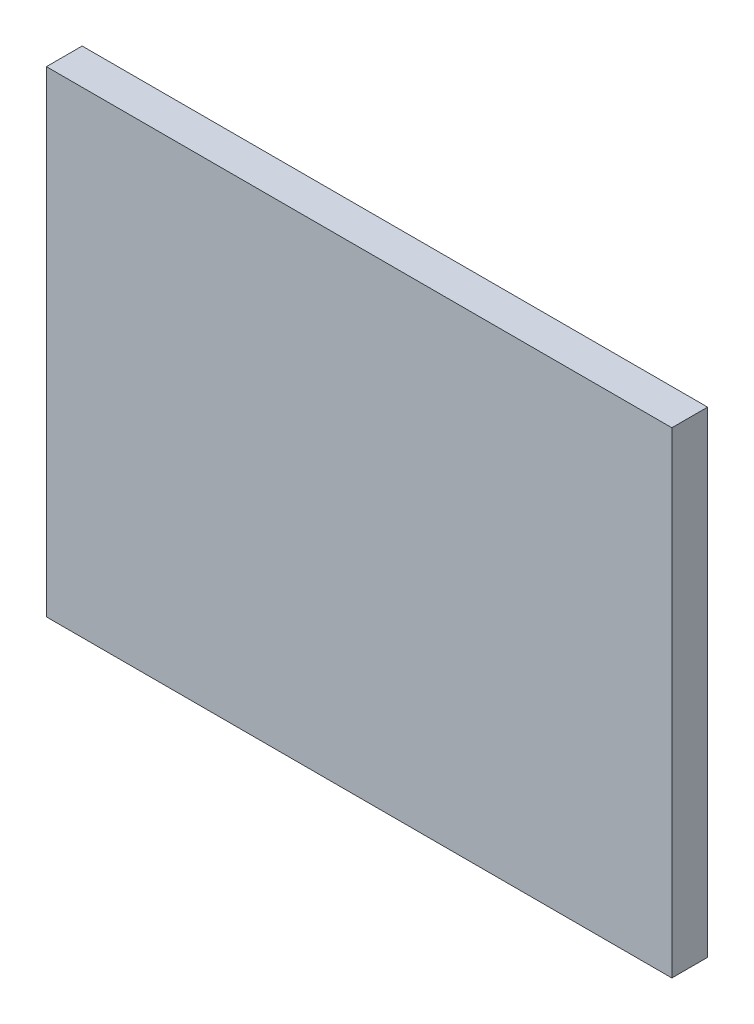
ISO-10303-21;
HEADER;
FILE_DESCRIPTION(('STEP AP214'),'2;1');
FILE_NAME('part.step','',(''),(''),'','','');
FILE_SCHEMA(('AUTOMOTIVE_DESIGN { 1 0 10303 214 1 1 1 1 }'));
ENDSEC;
DATA;
#1=APPLICATION_CONTEXT('core data for automotive mechanical design processes');
#2=APPLICATION_PROTOCOL_DEFINITION('international standard','automotive_design',2000,#1);
#3=PRODUCT_CONTEXT('',#1,'mechanical');
#4=PRODUCT('Part','Part','',(#3));
#5=PRODUCT_RELATED_PRODUCT_CATEGORY('part','',(#4));
#6=PRODUCT_DEFINITION_FORMATION('','',#4);
#7=PRODUCT_DEFINITION_CONTEXT('part definition',#1,'design');
#8=PRODUCT_DEFINITION('design','',#6,#7);
#9=PRODUCT_DEFINITION_SHAPE('','',#8);
#10=(LENGTH_UNIT() NAMED_UNIT(*) SI_UNIT(.MILLI.,.METRE.));
#11=(NAMED_UNIT(*) PLANE_ANGLE_UNIT() SI_UNIT($,.RADIAN.));
#12=(NAMED_UNIT(*) SI_UNIT($,.STERADIAN.) SOLID_ANGLE_UNIT());
#13=UNCERTAINTY_MEASURE_WITH_UNIT(LENGTH_MEASURE(1.E-05),#10,'distance_accuracy_value','');
#14=(GEOMETRIC_REPRESENTATION_CONTEXT(3) GLOBAL_UNCERTAINTY_ASSIGNED_CONTEXT((#13)) GLOBAL_UNIT_ASSIGNED_CONTEXT((#10,
#11,#12)) REPRESENTATION_CONTEXT('',''));
#15=CARTESIAN_POINT('',(0.,0.,0.));
#16=DIRECTION('',(0.,0.,1.));
#17=DIRECTION('',(1.,0.,0.));
#18=AXIS2_PLACEMENT_3D('',#15,#16,#17);
#19=CARTESIAN_POINT('',(0.,0.,0.));
#20=DIRECTION('',(0.,0.,1.));
#21=DIRECTION('',(1.,0.,0.));
#22=AXIS2_PLACEMENT_3D('',#19,#20,#21);
#23=PLANE('',#22);
#24=DIRECTION('',(1.,0.,0.));
#25=VECTOR('',#24,1.);
#26=CARTESIAN_POINT('',(-21.,-16.,0.));
#27=LINE('',#26,#25);
#28=CARTESIAN_POINT('',(21.,-16.,0.));
#29=VERTEX_POINT('',#28);
#30=CARTESIAN_POINT('',(-21.,-16.,0.));
#31=VERTEX_POINT('',#30);
#32=EDGE_CURVE('E81',#29,#31,#27,.F.);
#33=ORIENTED_EDGE('',*,*,#32,.T.);
#34=DIRECTION('',(0.,1.,0.));
#35=VECTOR('',#34,1.);
#36=CARTESIAN_POINT('',(-21.,16.,0.));
#37=LINE('',#36,#35);
#38=CARTESIAN_POINT('',(-21.,16.,0.));
#39=VERTEX_POINT('',#38);
#40=EDGE_CURVE('E68',#31,#39,#37,.T.);
#41=ORIENTED_EDGE('',*,*,#40,.T.);
#42=DIRECTION('',(1.,0.,0.));
#43=VECTOR('',#42,1.);
#44=CARTESIAN_POINT('',(-21.,16.,0.));
#45=LINE('',#44,#43);
#46=CARTESIAN_POINT('',(21.,16.,0.));
#47=VERTEX_POINT('',#46);
#48=EDGE_CURVE('E55',#39,#47,#45,.T.);
#49=ORIENTED_EDGE('',*,*,#48,.T.);
#50=DIRECTION('',(0.,-1.,0.));
#51=VECTOR('',#50,1.);
#52=CARTESIAN_POINT('',(21.,16.,0.));
#53=LINE('',#52,#51);
#54=EDGE_CURVE('E20',#47,#29,#53,.T.);
#55=ORIENTED_EDGE('',*,*,#54,.T.);
#56=EDGE_LOOP('',(#33,#41,#49,#55));
#57=FACE_BOUND('',#56,.T.);
#58=ADVANCED_FACE('F17',(#57),#23,.F.);
#59=CARTESIAN_POINT('',(21.,16.,2.4));
#60=DIRECTION('',(-1.,0.,0.));
#61=DIRECTION('',(0.,-1.,0.));
#62=AXIS2_PLACEMENT_3D('',#59,#60,#61);
#63=PLANE('',#62);
#64=DIRECTION('',(0.,0.,-1.));
#65=VECTOR('',#64,1.);
#66=CARTESIAN_POINT('',(21.,16.,2.4));
#67=LINE('',#66,#65);
#68=CARTESIAN_POINT('',(21.,16.,2.4));
#69=VERTEX_POINT('',#68);
#70=EDGE_CURVE('E61',#47,#69,#67,.F.);
#71=ORIENTED_EDGE('',*,*,#70,.T.);
#72=DIRECTION('',(0.,1.,0.));
#73=VECTOR('',#72,1.);
#74=CARTESIAN_POINT('',(21.,0.,2.4));
#75=LINE('',#74,#73);
#76=CARTESIAN_POINT('',(21.,-16.,2.4));
#77=VERTEX_POINT('',#76);
#78=EDGE_CURVE('E83',#77,#69,#75,.T.);
#79=ORIENTED_EDGE('',*,*,#78,.F.);
#80=DIRECTION('',(0.,0.,1.));
#81=VECTOR('',#80,1.);
#82=CARTESIAN_POINT('',(21.,-16.,2.4));
#83=LINE('',#82,#81);
#84=EDGE_CURVE('E64',#77,#29,#83,.F.);
#85=ORIENTED_EDGE('',*,*,#84,.T.);
#86=ORIENTED_EDGE('',*,*,#54,.F.);
#87=EDGE_LOOP('',(#71,#79,#85,#86));
#88=FACE_BOUND('',#87,.T.);
#89=ADVANCED_FACE('F60',(#88),#63,.F.);
#90=CARTESIAN_POINT('',(-21.,16.,2.4));
#91=DIRECTION('',(0.,-1.,0.));
#92=DIRECTION('',(0.,0.,-1.));
#93=AXIS2_PLACEMENT_3D('',#90,#91,#92);
#94=PLANE('',#93);
#95=DIRECTION('',(0.,0.,1.));
#96=VECTOR('',#95,1.);
#97=CARTESIAN_POINT('',(-21.,16.,2.4));
#98=LINE('',#97,#96);
#99=CARTESIAN_POINT('',(-21.,16.,2.4));
#100=VERTEX_POINT('',#99);
#101=EDGE_CURVE('E70',#39,#100,#98,.T.);
#102=ORIENTED_EDGE('',*,*,#101,.T.);
#103=DIRECTION('',(1.,0.,0.));
#104=VECTOR('',#103,1.);
#105=CARTESIAN_POINT('',(0.,16.,2.4));
#106=LINE('',#105,#104);
#107=EDGE_CURVE('E74',#69,#100,#106,.F.);
#108=ORIENTED_EDGE('',*,*,#107,.F.);
#109=ORIENTED_EDGE('',*,*,#70,.F.);
#110=ORIENTED_EDGE('',*,*,#48,.F.);
#111=EDGE_LOOP('',(#102,#108,#109,#110));
#112=FACE_BOUND('',#111,.T.);
#113=ADVANCED_FACE('F72',(#112),#94,.F.);
#114=CARTESIAN_POINT('',(-21.,16.,2.4));
#115=DIRECTION('',(1.,0.,0.));
#116=DIRECTION('',(0.,1.,0.));
#117=AXIS2_PLACEMENT_3D('',#114,#115,#116);
#118=PLANE('',#117);
#119=DIRECTION('',(0.,0.,1.));
#120=VECTOR('',#119,1.);
#121=CARTESIAN_POINT('',(-21.,-16.,2.4));
#122=LINE('',#121,#120);
#123=CARTESIAN_POINT('',(-21.,-16.,2.4));
#124=VERTEX_POINT('',#123);
#125=EDGE_CURVE('E35',#31,#124,#122,.T.);
#126=ORIENTED_EDGE('',*,*,#125,.T.);
#127=DIRECTION('',(0.,1.,0.));
#128=VECTOR('',#127,1.);
#129=CARTESIAN_POINT('',(-21.,0.,2.4));
#130=LINE('',#129,#128);
#131=EDGE_CURVE('E26',#100,#124,#130,.F.);
#132=ORIENTED_EDGE('',*,*,#131,.F.);
#133=ORIENTED_EDGE('',*,*,#101,.F.);
#134=ORIENTED_EDGE('',*,*,#40,.F.);
#135=EDGE_LOOP('',(#126,#132,#133,#134));
#136=FACE_BOUND('',#135,.T.);
#137=ADVANCED_FACE('F89',(#136),#118,.F.);
#138=CARTESIAN_POINT('',(-21.,-16.,2.4));
#139=DIRECTION('',(0.,1.,0.));
#140=DIRECTION('',(0.,0.,1.));
#141=AXIS2_PLACEMENT_3D('',#138,#139,#140);
#142=PLANE('',#141);
#143=ORIENTED_EDGE('',*,*,#84,.F.);
#144=DIRECTION('',(1.,0.,0.));
#145=VECTOR('',#144,1.);
#146=CARTESIAN_POINT('',(0.,-16.,2.4));
#147=LINE('',#146,#145);
#148=EDGE_CURVE('E11',#124,#77,#147,.T.);
#149=ORIENTED_EDGE('',*,*,#148,.F.);
#150=ORIENTED_EDGE('',*,*,#125,.F.);
#151=ORIENTED_EDGE('',*,*,#32,.F.);
#152=EDGE_LOOP('',(#143,#149,#150,#151));
#153=FACE_BOUND('',#152,.T.);
#154=ADVANCED_FACE('F91',(#153),#142,.F.);
#155=CARTESIAN_POINT('',(0.,0.,2.4));
#156=DIRECTION('',(0.,0.,1.));
#157=DIRECTION('',(1.,0.,0.));
#158=AXIS2_PLACEMENT_3D('',#155,#156,#157);
#159=PLANE('',#158);
#160=ORIENTED_EDGE('',*,*,#131,.T.);
#161=ORIENTED_EDGE('',*,*,#148,.T.);
#162=ORIENTED_EDGE('',*,*,#78,.T.);
#163=ORIENTED_EDGE('',*,*,#107,.T.);
#164=EDGE_LOOP('',(#160,#161,#162,#163));
#165=FACE_BOUND('',#164,.T.);
#166=ADVANCED_FACE('F88',(#165),#159,.T.);
#167=CLOSED_SHELL('',(#58,#89,#113,#137,#154,#166));
#168=MANIFOLD_SOLID_BREP('B1',#167);
#169=ADVANCED_BREP_SHAPE_REPRESENTATION('',(#18,#168),#14);
#170=SHAPE_DEFINITION_REPRESENTATION(#9,#169);
ENDSEC;
END-ISO-10303-21;
